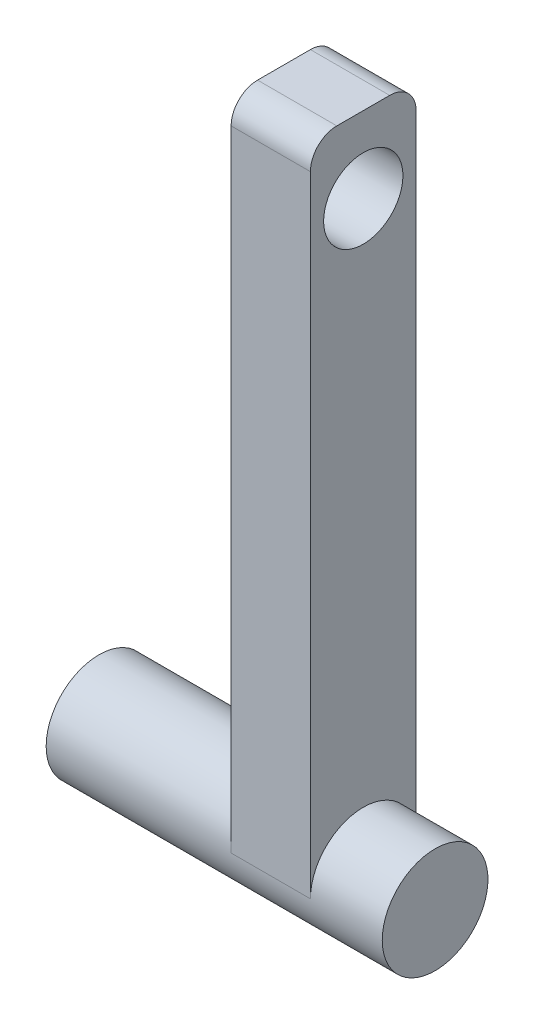
ISO-10303-21;
HEADER;
FILE_DESCRIPTION(('STEP AP214'),'2;1');
FILE_NAME('part.step','',(''),(''),'','','');
FILE_SCHEMA(('AUTOMOTIVE_DESIGN { 1 0 10303 214 1 1 1 1 }'));
ENDSEC;
DATA;
#1=APPLICATION_CONTEXT('core data for automotive mechanical design processes');
#2=APPLICATION_PROTOCOL_DEFINITION('international standard','automotive_design',2000,#1);
#3=PRODUCT_CONTEXT('',#1,'mechanical');
#4=PRODUCT('Part','Part','',(#3));
#5=PRODUCT_RELATED_PRODUCT_CATEGORY('part','',(#4));
#6=PRODUCT_DEFINITION_FORMATION('','',#4);
#7=PRODUCT_DEFINITION_CONTEXT('part definition',#1,'design');
#8=PRODUCT_DEFINITION('design','',#6,#7);
#9=PRODUCT_DEFINITION_SHAPE('','',#8);
#10=(LENGTH_UNIT() NAMED_UNIT(*) SI_UNIT(.MILLI.,.METRE.));
#11=(NAMED_UNIT(*) PLANE_ANGLE_UNIT() SI_UNIT($,.RADIAN.));
#12=(NAMED_UNIT(*) SI_UNIT($,.STERADIAN.) SOLID_ANGLE_UNIT());
#13=UNCERTAINTY_MEASURE_WITH_UNIT(LENGTH_MEASURE(1.E-05),#10,'distance_accuracy_value','');
#14=(GEOMETRIC_REPRESENTATION_CONTEXT(3) GLOBAL_UNCERTAINTY_ASSIGNED_CONTEXT((#13)) GLOBAL_UNIT_ASSIGNED_CONTEXT((#10,
#11,#12)) REPRESENTATION_CONTEXT('',''));
#15=CARTESIAN_POINT('',(0.,0.,0.));
#16=DIRECTION('',(0.,0.,1.));
#17=DIRECTION('',(1.,0.,0.));
#18=AXIS2_PLACEMENT_3D('',#15,#16,#17);
#19=CARTESIAN_POINT('',(10.,7.00051490063158,10.6584652997722));
#20=DIRECTION('',(0.,0.,-1.));
#21=DIRECTION('',(-1.,0.,0.));
#22=AXIS2_PLACEMENT_3D('',#19,#20,#21);
#23=PLANE('',#22);
#24=DIRECTION('',(0.,-1.,0.));
#25=VECTOR('',#24,1.);
#26=CARTESIAN_POINT('',(7.,7.00051490063158,10.6584652997722));
#27=LINE('',#26,#25);
#28=CARTESIAN_POINT('',(7.,30.8318907429619,10.6584652997722));
#29=VERTEX_POINT('',#28);
#30=CARTESIAN_POINT('',(7.,7.00051490063158,10.6584652997722));
#31=VERTEX_POINT('',#30);
#32=EDGE_CURVE('E110',#29,#31,#27,.T.);
#33=ORIENTED_EDGE('',*,*,#32,.F.);
#34=DIRECTION('',(-1.,0.,0.));
#35=VECTOR('',#34,1.);
#36=CARTESIAN_POINT('',(10.,30.8318907429619,10.6584652997722));
#37=LINE('',#36,#35);
#38=CARTESIAN_POINT('',(10.,30.8318907429619,10.6584652997722));
#39=VERTEX_POINT('',#38);
#40=EDGE_CURVE('E12',#29,#39,#37,.F.);
#41=ORIENTED_EDGE('',*,*,#40,.T.);
#42=DIRECTION('',(0.,-1.,0.));
#43=VECTOR('',#42,1.);
#44=CARTESIAN_POINT('',(10.,7.00051490063158,10.6584652997722));
#45=LINE('',#44,#43);
#46=CARTESIAN_POINT('',(10.,7.00051490063158,10.6584652997722));
#47=VERTEX_POINT('',#46);
#48=EDGE_CURVE('E133',#39,#47,#45,.T.);
#49=ORIENTED_EDGE('',*,*,#48,.T.);
#50=DIRECTION('',(-1.,0.,0.));
#51=VECTOR('',#50,1.);
#52=CARTESIAN_POINT('',(10.,7.00051490063158,10.6584652997722));
#53=LINE('',#52,#51);
#54=EDGE_CURVE('E127',#47,#31,#53,.T.);
#55=ORIENTED_EDGE('',*,*,#54,.T.);
#56=EDGE_LOOP('',(#33,#41,#49,#55));
#57=FACE_BOUND('',#56,.T.);
#58=ADVANCED_FACE('F59',(#57),#23,.T.);
#59=CARTESIAN_POINT('',(10.,13.7604693074356,14.6584652997722));
#60=DIRECTION('',(0.,0.,1.));
#61=DIRECTION('',(1.,0.,0.));
#62=AXIS2_PLACEMENT_3D('',#59,#60,#61);
#63=PLANE('',#62);
#64=DIRECTION('',(0.,1.,0.));
#65=VECTOR('',#64,1.);
#66=CARTESIAN_POINT('',(10.,13.7604693074356,14.6584652997722));
#67=LINE('',#66,#65);
#68=CARTESIAN_POINT('',(10.,7.00051490063158,14.6584652997722));
#69=VERTEX_POINT('',#68);
#70=CARTESIAN_POINT('',(10.,30.8318907429619,14.6584652997722));
#71=VERTEX_POINT('',#70);
#72=EDGE_CURVE('E120',#69,#71,#67,.T.);
#73=ORIENTED_EDGE('',*,*,#72,.T.);
#74=DIRECTION('',(-1.,0.,0.));
#75=VECTOR('',#74,1.);
#76=CARTESIAN_POINT('',(7.,30.8318907429619,14.6584652997722));
#77=LINE('',#76,#75);
#78=CARTESIAN_POINT('',(7.,30.8318907429619,14.6584652997722));
#79=VERTEX_POINT('',#78);
#80=EDGE_CURVE('E147',#71,#79,#77,.T.);
#81=ORIENTED_EDGE('',*,*,#80,.T.);
#82=DIRECTION('',(0.,1.,0.));
#83=VECTOR('',#82,1.);
#84=CARTESIAN_POINT('',(7.,13.7604693074356,14.6584652997722));
#85=LINE('',#84,#83);
#86=CARTESIAN_POINT('',(7.,7.00051490063158,14.6584652997722));
#87=VERTEX_POINT('',#86);
#88=EDGE_CURVE('E121',#87,#79,#85,.T.);
#89=ORIENTED_EDGE('',*,*,#88,.F.);
#90=DIRECTION('',(-1.,0.,0.));
#91=VECTOR('',#90,1.);
#92=CARTESIAN_POINT('',(10.,7.00051490063158,14.6584652997722));
#93=LINE('',#92,#91);
#94=EDGE_CURVE('E130',#69,#87,#93,.T.);
#95=ORIENTED_EDGE('',*,*,#94,.F.);
#96=EDGE_LOOP('',(#73,#81,#89,#95));
#97=FACE_BOUND('',#96,.T.);
#98=ADVANCED_FACE('F168',(#97),#63,.T.);
#99=CARTESIAN_POINT('',(42.,7.00051490063158,12.6584652997722));
#100=DIRECTION('',(-1.,0.,0.));
#101=DIRECTION('',(0.,0.,1.));
#102=AXIS2_PLACEMENT_3D('',#99,#100,#101);
#103=CYLINDRICAL_SURFACE('',#102,2.);
#104=CARTESIAN_POINT('',(0.,7.00051490063158,12.6584652997722));
#105=DIRECTION('',(1.,0.,0.));
#106=DIRECTION('',(0.,0.,-1.));
#107=AXIS2_PLACEMENT_3D('',#104,#105,#106);
#108=CIRCLE('',#107,2.);
#109=CARTESIAN_POINT('',(0.,7.00051490063158,10.6584652997722));
#110=VERTEX_POINT('',#109);
#111=EDGE_CURVE('E134',#110,#110,#108,.T.);
#112=ORIENTED_EDGE('',*,*,#111,.T.);
#113=EDGE_LOOP('',(#112));
#114=FACE_BOUND('',#113,.T.);
#115=CARTESIAN_POINT('',(12.7187385844022,7.00051490063158,12.6584652997722));
#116=DIRECTION('',(-1.,0.,0.));
#117=DIRECTION('',(0.,0.,1.));
#118=AXIS2_PLACEMENT_3D('',#115,#116,#117);
#119=CIRCLE('',#118,2.);
#120=CARTESIAN_POINT('',(12.7187385844022,7.00051490063158,14.6584652997722));
#121=VERTEX_POINT('',#120);
#122=EDGE_CURVE('E144',#121,#121,#119,.T.);
#123=ORIENTED_EDGE('',*,*,#122,.T.);
#124=EDGE_LOOP('',(#123));
#125=FACE_BOUND('',#124,.T.);
#126=CARTESIAN_POINT('',(10.,7.00051490063158,12.6584652997722));
#127=DIRECTION('',(-1.,0.,0.));
#128=DIRECTION('',(0.,0.,1.));
#129=AXIS2_PLACEMENT_3D('',#126,#127,#128);
#130=CIRCLE('',#129,2.);
#131=EDGE_CURVE('E137',#69,#47,#130,.T.);
#132=ORIENTED_EDGE('',*,*,#131,.F.);
#133=ORIENTED_EDGE('',*,*,#94,.T.);
#134=CARTESIAN_POINT('',(7.,7.00051490063158,12.6584652997722));
#135=DIRECTION('',(1.,0.,0.));
#136=DIRECTION('',(0.,0.,1.));
#137=AXIS2_PLACEMENT_3D('',#134,#135,#136);
#138=CIRCLE('',#137,2.);
#139=EDGE_CURVE('E115',#31,#87,#138,.T.);
#140=ORIENTED_EDGE('',*,*,#139,.F.);
#141=ORIENTED_EDGE('',*,*,#54,.F.);
#142=EDGE_LOOP('',(#132,#133,#140,#141));
#143=FACE_BOUND('',#142,.T.);
#144=ADVANCED_FACE('F126',(#114,#125,#143),#103,.T.);
#145=CARTESIAN_POINT('',(0.,7.00051490063158,12.6584652997722));
#146=DIRECTION('',(1.,0.,0.));
#147=DIRECTION('',(0.,0.,-1.));
#148=AXIS2_PLACEMENT_3D('',#145,#146,#147);
#149=PLANE('',#148);
#150=ORIENTED_EDGE('',*,*,#111,.F.);
#151=EDGE_LOOP('',(#150));
#152=FACE_BOUND('',#151,.T.);
#153=ADVANCED_FACE('F188',(#152),#149,.F.);
#154=CARTESIAN_POINT('',(10.,7.00051490063158,12.6584652997722));
#155=DIRECTION('',(-1.,0.,0.));
#156=DIRECTION('',(0.,0.,1.));
#157=AXIS2_PLACEMENT_3D('',#154,#155,#156);
#158=PLANE('',#157);
#159=DIRECTION('',(0.,0.,-1.));
#160=VECTOR('',#159,1.);
#161=CARTESIAN_POINT('',(10.,31.8318907429619,10.6584652997722));
#162=LINE('',#161,#160);
#163=CARTESIAN_POINT('',(10.,31.8318907429619,13.6584652997722));
#164=VERTEX_POINT('',#163);
#165=CARTESIAN_POINT('',(10.,31.8318907429619,11.6584652997722));
#166=VERTEX_POINT('',#165);
#167=EDGE_CURVE('E163',#164,#166,#162,.T.);
#168=ORIENTED_EDGE('',*,*,#167,.F.);
#169=CARTESIAN_POINT('',(10.,30.8318907429619,13.6584652997722));
#170=DIRECTION('',(-1.,0.,0.));
#171=DIRECTION('',(0.,0.,1.));
#172=AXIS2_PLACEMENT_3D('',#169,#170,#171);
#173=CIRCLE('',#172,1.);
#174=EDGE_CURVE('E67',#164,#71,#173,.F.);
#175=ORIENTED_EDGE('',*,*,#174,.T.);
#176=ORIENTED_EDGE('',*,*,#72,.F.);
#177=ORIENTED_EDGE('',*,*,#131,.T.);
#178=ORIENTED_EDGE('',*,*,#48,.F.);
#179=CARTESIAN_POINT('',(10.,30.8318907429619,11.6584652997722));
#180=DIRECTION('',(-1.,0.,0.));
#181=DIRECTION('',(0.,0.,1.));
#182=AXIS2_PLACEMENT_3D('',#179,#180,#181);
#183=CIRCLE('',#182,1.);
#184=EDGE_CURVE('E79',#39,#166,#183,.F.);
#185=ORIENTED_EDGE('',*,*,#184,.T.);
#186=EDGE_LOOP('',(#168,#175,#176,#177,#178,#185));
#187=FACE_BOUND('',#186,.T.);
#188=CARTESIAN_POINT('',(10.,28.9539622473953,12.6584652997722));
#189=DIRECTION('',(-1.,0.,0.));
#190=DIRECTION('',(0.,0.,1.));
#191=AXIS2_PLACEMENT_3D('',#188,#189,#190);
#192=CIRCLE('',#191,1.49999999999999);
#193=CARTESIAN_POINT('',(10.,28.9539622473953,14.1584652997722));
#194=VERTEX_POINT('',#193);
#195=EDGE_CURVE('E131',#194,#194,#192,.F.);
#196=ORIENTED_EDGE('',*,*,#195,.F.);
#197=EDGE_LOOP('',(#196));
#198=FACE_BOUND('',#197,.T.);
#199=ADVANCED_FACE('F161',(#187,#198),#158,.F.);
#200=CARTESIAN_POINT('',(7.,7.00051490063158,12.6584652997722));
#201=DIRECTION('',(-1.,0.,0.));
#202=DIRECTION('',(0.,0.,1.));
#203=AXIS2_PLACEMENT_3D('',#200,#201,#202);
#204=PLANE('',#203);
#205=ORIENTED_EDGE('',*,*,#88,.T.);
#206=CARTESIAN_POINT('',(7.,30.8318907429619,13.6584652997722));
#207=DIRECTION('',(-1.,0.,0.));
#208=DIRECTION('',(0.,0.,1.));
#209=AXIS2_PLACEMENT_3D('',#206,#207,#208);
#210=CIRCLE('',#209,1.);
#211=CARTESIAN_POINT('',(7.,31.8318907429619,13.6584652997722));
#212=VERTEX_POINT('',#211);
#213=EDGE_CURVE('E151',#79,#212,#210,.T.);
#214=ORIENTED_EDGE('',*,*,#213,.T.);
#215=DIRECTION('',(0.,0.,1.));
#216=VECTOR('',#215,1.);
#217=CARTESIAN_POINT('',(7.,31.8318907429619,10.6584652997722));
#218=LINE('',#217,#216);
#219=CARTESIAN_POINT('',(7.,31.8318907429619,11.6584652997722));
#220=VERTEX_POINT('',#219);
#221=EDGE_CURVE('E171',#220,#212,#218,.T.);
#222=ORIENTED_EDGE('',*,*,#221,.F.);
#223=CARTESIAN_POINT('',(7.,30.8318907429619,11.6584652997722));
#224=DIRECTION('',(-1.,0.,0.));
#225=DIRECTION('',(0.,0.,1.));
#226=AXIS2_PLACEMENT_3D('',#223,#224,#225);
#227=CIRCLE('',#226,1.);
#228=EDGE_CURVE('E118',#220,#29,#227,.T.);
#229=ORIENTED_EDGE('',*,*,#228,.T.);
#230=ORIENTED_EDGE('',*,*,#32,.T.);
#231=ORIENTED_EDGE('',*,*,#139,.T.);
#232=EDGE_LOOP('',(#205,#214,#222,#229,#230,#231));
#233=FACE_BOUND('',#232,.T.);
#234=CARTESIAN_POINT('',(7.,28.9539622473953,12.6584652997722));
#235=DIRECTION('',(-1.,0.,0.));
#236=DIRECTION('',(0.,0.,1.));
#237=AXIS2_PLACEMENT_3D('',#234,#235,#236);
#238=CIRCLE('',#237,1.49999999999999);
#239=CARTESIAN_POINT('',(7.,28.9539622473953,14.1584652997722));
#240=VERTEX_POINT('',#239);
#241=EDGE_CURVE('E175',#240,#240,#238,.T.);
#242=ORIENTED_EDGE('',*,*,#241,.F.);
#243=EDGE_LOOP('',(#242));
#244=FACE_BOUND('',#243,.T.);
#245=ADVANCED_FACE('F113',(#233,#244),#204,.T.);
#246=CARTESIAN_POINT('',(12.7187385844022,13.7255101557307,14.6584652997722));
#247=DIRECTION('',(-1.,0.,0.));
#248=DIRECTION('',(0.,0.,1.));
#249=AXIS2_PLACEMENT_3D('',#246,#247,#248);
#250=PLANE('',#249);
#251=ORIENTED_EDGE('',*,*,#122,.F.);
#252=EDGE_LOOP('',(#251));
#253=FACE_BOUND('',#252,.T.);
#254=ADVANCED_FACE('F194',(#253),#250,.F.);
#255=CARTESIAN_POINT('',(23.4185830896397,28.9539622473953,12.6584652997722));
#256=DIRECTION('',(-1.,0.,0.));
#257=DIRECTION('',(0.,0.,1.));
#258=AXIS2_PLACEMENT_3D('',#255,#256,#257);
#259=CYLINDRICAL_SURFACE('',#258,1.49999999999999);
#260=ORIENTED_EDGE('',*,*,#195,.T.);
#261=EDGE_LOOP('',(#260));
#262=FACE_BOUND('',#261,.T.);
#263=ORIENTED_EDGE('',*,*,#241,.T.);
#264=EDGE_LOOP('',(#263));
#265=FACE_BOUND('',#264,.T.);
#266=ADVANCED_FACE('F185',(#262,#265),#259,.F.);
#267=CARTESIAN_POINT('',(23.4185830896397,31.8318907429619,10.6584652997722));
#268=DIRECTION('',(0.,-1.,0.));
#269=DIRECTION('',(0.,0.,-1.));
#270=AXIS2_PLACEMENT_3D('',#267,#268,#269);
#271=PLANE('',#270);
#272=ORIENTED_EDGE('',*,*,#221,.T.);
#273=DIRECTION('',(-1.,0.,0.));
#274=VECTOR('',#273,1.);
#275=CARTESIAN_POINT('',(10.,31.8318907429619,13.6584652997722));
#276=LINE('',#275,#274);
#277=EDGE_CURVE('E156',#212,#164,#276,.F.);
#278=ORIENTED_EDGE('',*,*,#277,.T.);
#279=ORIENTED_EDGE('',*,*,#167,.T.);
#280=DIRECTION('',(-1.,0.,0.));
#281=VECTOR('',#280,1.);
#282=CARTESIAN_POINT('',(7.,31.8318907429619,11.6584652997722));
#283=LINE('',#282,#281);
#284=EDGE_CURVE('E153',#166,#220,#283,.T.);
#285=ORIENTED_EDGE('',*,*,#284,.T.);
#286=EDGE_LOOP('',(#272,#278,#279,#285));
#287=FACE_BOUND('',#286,.T.);
#288=ADVANCED_FACE('F173',(#287),#271,.F.);
#289=CARTESIAN_POINT('',(10.,30.8318907429619,13.6584652997722));
#290=DIRECTION('',(1.,0.,0.));
#291=DIRECTION('',(0.,0.,-1.));
#292=AXIS2_PLACEMENT_3D('',#289,#290,#291);
#293=CYLINDRICAL_SURFACE('',#292,1.);
#294=ORIENTED_EDGE('',*,*,#174,.F.);
#295=ORIENTED_EDGE('',*,*,#277,.F.);
#296=ORIENTED_EDGE('',*,*,#213,.F.);
#297=ORIENTED_EDGE('',*,*,#80,.F.);
#298=EDGE_LOOP('',(#294,#295,#296,#297));
#299=FACE_BOUND('',#298,.T.);
#300=ADVANCED_FACE('F169',(#299),#293,.T.);
#301=CARTESIAN_POINT('',(23.4185830896397,30.8318907429619,11.6584652997722));
#302=DIRECTION('',(1.,0.,0.));
#303=DIRECTION('',(0.,0.,-1.));
#304=AXIS2_PLACEMENT_3D('',#301,#302,#303);
#305=CYLINDRICAL_SURFACE('',#304,1.);
#306=ORIENTED_EDGE('',*,*,#184,.F.);
#307=ORIENTED_EDGE('',*,*,#40,.F.);
#308=ORIENTED_EDGE('',*,*,#228,.F.);
#309=ORIENTED_EDGE('',*,*,#284,.F.);
#310=EDGE_LOOP('',(#306,#307,#308,#309));
#311=FACE_BOUND('',#310,.T.);
#312=ADVANCED_FACE('F61',(#311),#305,.T.);
#313=CLOSED_SHELL('',(#58,#98,#144,#153,#199,#245,#254,#266,#288,#300,#312));
#314=MANIFOLD_SOLID_BREP('B2',#313);
#315=ADVANCED_BREP_SHAPE_REPRESENTATION('',(#18,#314),#14);
#316=SHAPE_DEFINITION_REPRESENTATION(#9,#315);
ENDSEC;
END-ISO-10303-21;
